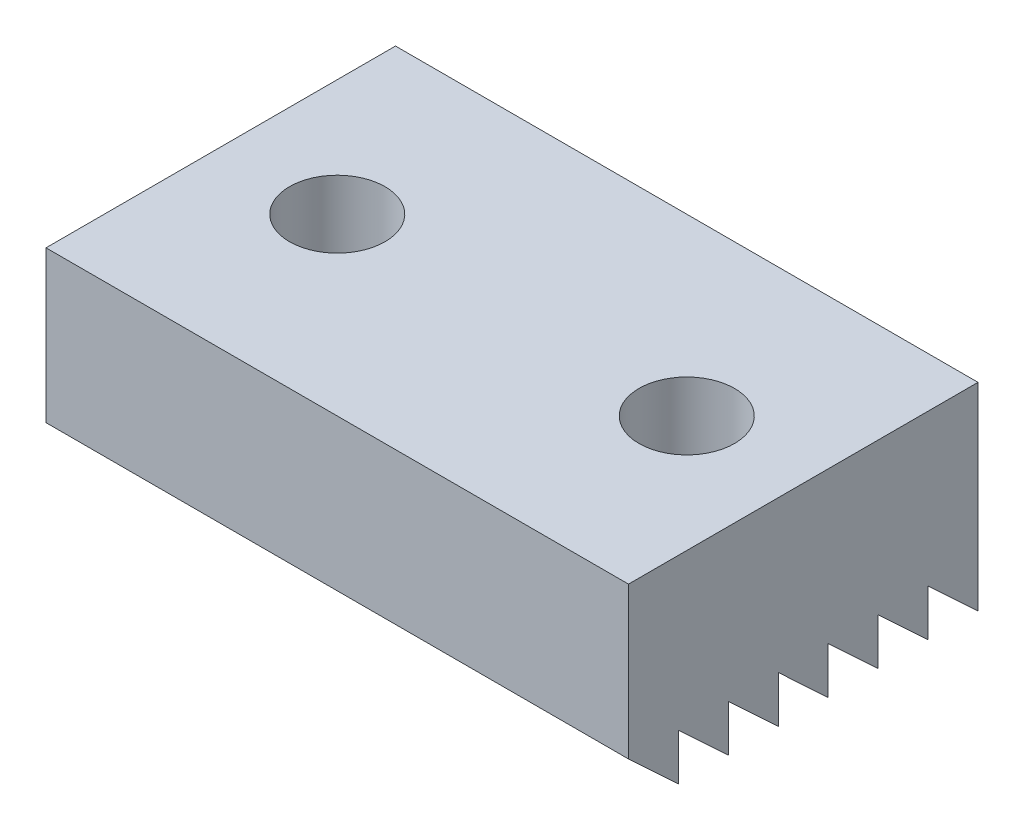
ISO-10303-21;
HEADER;
FILE_DESCRIPTION(('STEP AP214'),'2;1');
FILE_NAME('part.step','',(''),(''),'','','');
FILE_SCHEMA(('AUTOMOTIVE_DESIGN { 1 0 10303 214 1 1 1 1 }'));
ENDSEC;
DATA;
#1=APPLICATION_CONTEXT('core data for automotive mechanical design processes');
#2=APPLICATION_PROTOCOL_DEFINITION('international standard','automotive_design',2000,#1);
#3=PRODUCT_CONTEXT('',#1,'mechanical');
#4=PRODUCT('Part','Part','',(#3));
#5=PRODUCT_RELATED_PRODUCT_CATEGORY('part','',(#4));
#6=PRODUCT_DEFINITION_FORMATION('','',#4);
#7=PRODUCT_DEFINITION_CONTEXT('part definition',#1,'design');
#8=PRODUCT_DEFINITION('design','',#6,#7);
#9=PRODUCT_DEFINITION_SHAPE('','',#8);
#10=(LENGTH_UNIT() NAMED_UNIT(*) SI_UNIT(.MILLI.,.METRE.));
#11=(NAMED_UNIT(*) PLANE_ANGLE_UNIT() SI_UNIT($,.RADIAN.));
#12=(NAMED_UNIT(*) SI_UNIT($,.STERADIAN.) SOLID_ANGLE_UNIT());
#13=UNCERTAINTY_MEASURE_WITH_UNIT(LENGTH_MEASURE(1.E-05),#10,'distance_accuracy_value','');
#14=(GEOMETRIC_REPRESENTATION_CONTEXT(3) GLOBAL_UNCERTAINTY_ASSIGNED_CONTEXT((#13)) GLOBAL_UNIT_ASSIGNED_CONTEXT((#10,
#11,#12)) REPRESENTATION_CONTEXT('',''));
#15=CARTESIAN_POINT('',(0.,0.,0.));
#16=DIRECTION('',(0.,0.,1.));
#17=DIRECTION('',(1.,0.,0.));
#18=AXIS2_PLACEMENT_3D('',#15,#16,#17);
#19=CARTESIAN_POINT('',(40.4029218007494,-1.5,-6.42857142857143));
#20=DIRECTION('',(0.,0.,-1.));
#21=DIRECTION('',(-1.,0.,0.));
#22=AXIS2_PLACEMENT_3D('',#19,#20,#21);
#23=PLANE('',#22);
#24=DIRECTION('',(0.,1.,0.));
#25=VECTOR('',#24,1.);
#26=CARTESIAN_POINT('',(3.25227553191971,-24.,-6.42857142857143));
#27=LINE('',#26,#25);
#28=CARTESIAN_POINT('',(3.25227553191971,-3.5,-6.42857142857143));
#29=VERTEX_POINT('',#28);
#30=CARTESIAN_POINT('',(3.25227553191972,-1.5,-6.42857142857143));
#31=VERTEX_POINT('',#30);
#32=EDGE_CURVE('E324',#29,#31,#27,.T.);
#33=ORIENTED_EDGE('',*,*,#32,.F.);
#34=DIRECTION('',(-1.,0.,0.));
#35=VECTOR('',#34,1.);
#36=CARTESIAN_POINT('',(40.4029218007494,-3.5,-6.42857142857143));
#37=LINE('',#36,#35);
#38=CARTESIAN_POINT('',(0.,-3.5,-6.42857142857143));
#39=VERTEX_POINT('',#38);
#40=EDGE_CURVE('E297',#29,#39,#37,.T.);
#41=ORIENTED_EDGE('',*,*,#40,.T.);
#42=DIRECTION('',(0.,-1.,0.));
#43=VECTOR('',#42,1.);
#44=CARTESIAN_POINT('',(0.,-1.5,-6.42857142857143));
#45=LINE('',#44,#43);
#46=CARTESIAN_POINT('',(0.,-1.5,-6.42857142857143));
#47=VERTEX_POINT('',#46);
#48=EDGE_CURVE('E373',#47,#39,#45,.T.);
#49=ORIENTED_EDGE('',*,*,#48,.F.);
#50=DIRECTION('',(-1.,0.,0.));
#51=VECTOR('',#50,1.);
#52=CARTESIAN_POINT('',(40.4029218007494,-1.5,-6.42857142857143));
#53=LINE('',#52,#51);
#54=EDGE_CURVE('E301',#31,#47,#53,.T.);
#55=ORIENTED_EDGE('',*,*,#54,.F.);
#56=EDGE_LOOP('',(#33,#41,#49,#55));
#57=FACE_BOUND('',#56,.T.);
#58=ADVANCED_FACE('F33',(#57),#23,.T.);
#59=DIRECTION('',(0.,1.,0.));
#60=VECTOR('',#59,1.);
#61=CARTESIAN_POINT('',(6.74772446808029,-24.,-6.42857142857143));
#62=LINE('',#61,#60);
#63=CARTESIAN_POINT('',(6.74772446808029,-1.5,-6.42857142857143));
#64=VERTEX_POINT('',#63);
#65=CARTESIAN_POINT('',(6.74772446808029,-3.5,-6.42857142857143));
#66=VERTEX_POINT('',#65);
#67=EDGE_CURVE('E319',#64,#66,#62,.F.);
#68=ORIENTED_EDGE('',*,*,#67,.F.);
#69=CARTESIAN_POINT('',(18.2522755319197,-1.5,-6.42857142857143));
#70=VERTEX_POINT('',#69);
#71=EDGE_CURVE('E300',#70,#64,#53,.T.);
#72=ORIENTED_EDGE('',*,*,#71,.F.);
#73=DIRECTION('',(0.,1.,0.));
#74=VECTOR('',#73,1.);
#75=CARTESIAN_POINT('',(18.2522755319197,-24.,-6.42857142857143));
#76=LINE('',#75,#74);
#77=CARTESIAN_POINT('',(18.2522755319197,-3.5,-6.42857142857143));
#78=VERTEX_POINT('',#77);
#79=EDGE_CURVE('E460',#78,#70,#76,.T.);
#80=ORIENTED_EDGE('',*,*,#79,.F.);
#81=EDGE_CURVE('E296',#78,#66,#37,.T.);
#82=ORIENTED_EDGE('',*,*,#81,.T.);
#83=EDGE_LOOP('',(#68,#72,#80,#82));
#84=FACE_BOUND('',#83,.T.);
#85=ADVANCED_FACE('F430',(#84),#23,.T.);
#86=CARTESIAN_POINT('',(40.4029218007494,-3.5,-8.57142857142857));
#87=DIRECTION('',(0.,-0.731055268242869,0.682318250360011));
#88=DIRECTION('',(0.,-0.682318250360011,-0.731055268242869));
#89=AXIS2_PLACEMENT_3D('',#86,#87,#88);
#90=PLANE('',#89);
#91=CARTESIAN_POINT('',(5.,-2.5,-7.5));
#92=DIRECTION('',(0.,-0.731055268242869,0.682318250360011));
#93=DIRECTION('',(0.,0.682318250360011,0.731055268242869));
#94=AXIS2_PLACEMENT_3D('',#91,#92,#93);
#95=ELLIPSE('',#94,2.80416555225337,2.05);
#96=CARTESIAN_POINT('',(3.25227553191971,-3.5,-8.57142857142857));
#97=VERTEX_POINT('',#96);
#98=EDGE_CURVE('E317',#31,#97,#95,.T.);
#99=ORIENTED_EDGE('',*,*,#98,.F.);
#100=ORIENTED_EDGE('',*,*,#54,.T.);
#101=DIRECTION('',(0.,0.682318250360011,0.731055268242869));
#102=VECTOR('',#101,1.);
#103=CARTESIAN_POINT('',(0.,-3.5,-8.57142857142857));
#104=LINE('',#103,#102);
#105=CARTESIAN_POINT('',(0.,-3.5,-8.57142857142857));
#106=VERTEX_POINT('',#105);
#107=EDGE_CURVE('E370',#106,#47,#104,.T.);
#108=ORIENTED_EDGE('',*,*,#107,.F.);
#109=DIRECTION('',(-1.,0.,0.));
#110=VECTOR('',#109,1.);
#111=CARTESIAN_POINT('',(40.4029218007494,-3.5,-8.57142857142857));
#112=LINE('',#111,#110);
#113=EDGE_CURVE('E212',#97,#106,#112,.T.);
#114=ORIENTED_EDGE('',*,*,#113,.F.);
#115=EDGE_LOOP('',(#99,#100,#108,#114));
#116=FACE_BOUND('',#115,.T.);
#117=ADVANCED_FACE('F438',(#116),#90,.T.);
#118=CARTESIAN_POINT('',(6.74772446808029,-3.5,-8.57142857142857));
#119=VERTEX_POINT('',#118);
#120=EDGE_CURVE('E315',#119,#64,#95,.T.);
#121=ORIENTED_EDGE('',*,*,#120,.F.);
#122=CARTESIAN_POINT('',(18.2522755319197,-3.5,-8.57142857142857));
#123=VERTEX_POINT('',#122);
#124=EDGE_CURVE('E216',#123,#119,#112,.T.);
#125=ORIENTED_EDGE('',*,*,#124,.F.);
#126=CARTESIAN_POINT('',(20.,-2.5,-7.5));
#127=DIRECTION('',(0.,-0.731055268242869,0.682318250360011));
#128=DIRECTION('',(0.,0.682318250360011,0.731055268242869));
#129=AXIS2_PLACEMENT_3D('',#126,#127,#128);
#130=ELLIPSE('',#129,2.80416555225337,2.05);
#131=EDGE_CURVE('E313',#70,#123,#130,.T.);
#132=ORIENTED_EDGE('',*,*,#131,.F.);
#133=ORIENTED_EDGE('',*,*,#71,.T.);
#134=EDGE_LOOP('',(#121,#125,#132,#133));
#135=FACE_BOUND('',#134,.T.);
#136=ADVANCED_FACE('F311',(#135),#90,.T.);
#137=CARTESIAN_POINT('',(40.4029218007494,-1.5,-8.57142857142857));
#138=DIRECTION('',(0.,0.,-1.));
#139=DIRECTION('',(-1.,0.,0.));
#140=AXIS2_PLACEMENT_3D('',#137,#138,#139);
#141=PLANE('',#140);
#142=DIRECTION('',(0.,1.,0.));
#143=VECTOR('',#142,1.);
#144=CARTESIAN_POINT('',(3.25227553191971,-24.,-8.57142857142857));
#145=LINE('',#144,#143);
#146=CARTESIAN_POINT('',(3.25227553191972,-1.5,-8.57142857142857));
#147=VERTEX_POINT('',#146);
#148=EDGE_CURVE('E47',#97,#147,#145,.T.);
#149=ORIENTED_EDGE('',*,*,#148,.F.);
#150=ORIENTED_EDGE('',*,*,#113,.T.);
#151=DIRECTION('',(0.,-1.,0.));
#152=VECTOR('',#151,1.);
#153=CARTESIAN_POINT('',(0.,-1.5,-8.57142857142857));
#154=LINE('',#153,#152);
#155=CARTESIAN_POINT('',(0.,-1.5,-8.57142857142857));
#156=VERTEX_POINT('',#155);
#157=EDGE_CURVE('E367',#156,#106,#154,.T.);
#158=ORIENTED_EDGE('',*,*,#157,.F.);
#159=DIRECTION('',(-1.,0.,0.));
#160=VECTOR('',#159,1.);
#161=CARTESIAN_POINT('',(40.4029218007494,-1.5,-8.57142857142857));
#162=LINE('',#161,#160);
#163=EDGE_CURVE('E215',#147,#156,#162,.T.);
#164=ORIENTED_EDGE('',*,*,#163,.F.);
#165=EDGE_LOOP('',(#149,#150,#158,#164));
#166=FACE_BOUND('',#165,.T.);
#167=ADVANCED_FACE('F485',(#166),#141,.T.);
#168=DIRECTION('',(0.,1.,0.));
#169=VECTOR('',#168,1.);
#170=CARTESIAN_POINT('',(6.74772446808029,-24.,-8.57142857142857));
#171=LINE('',#170,#169);
#172=CARTESIAN_POINT('',(6.74772446808029,-1.5,-8.57142857142857));
#173=VERTEX_POINT('',#172);
#174=EDGE_CURVE('E307',#173,#119,#171,.F.);
#175=ORIENTED_EDGE('',*,*,#174,.F.);
#176=CARTESIAN_POINT('',(18.2522755319197,-1.5,-8.57142857142857));
#177=VERTEX_POINT('',#176);
#178=EDGE_CURVE('E213',#177,#173,#162,.T.);
#179=ORIENTED_EDGE('',*,*,#178,.F.);
#180=DIRECTION('',(0.,1.,0.));
#181=VECTOR('',#180,1.);
#182=CARTESIAN_POINT('',(18.2522755319197,-24.,-8.57142857142857));
#183=LINE('',#182,#181);
#184=EDGE_CURVE('E55',#123,#177,#183,.T.);
#185=ORIENTED_EDGE('',*,*,#184,.F.);
#186=ORIENTED_EDGE('',*,*,#124,.T.);
#187=EDGE_LOOP('',(#175,#179,#185,#186));
#188=FACE_BOUND('',#187,.T.);
#189=ADVANCED_FACE('F306',(#188),#141,.T.);
#190=CARTESIAN_POINT('',(0.,5.,0.));
#191=DIRECTION('',(0.,-1.,0.));
#192=DIRECTION('',(0.,0.,-1.));
#193=AXIS2_PLACEMENT_3D('',#190,#191,#192);
#194=PLANE('',#193);
#195=DIRECTION('',(0.,0.,1.));
#196=VECTOR('',#195,1.);
#197=CARTESIAN_POINT('',(0.,5.,0.));
#198=LINE('',#197,#196);
#199=CARTESIAN_POINT('',(0.,5.,-15.));
#200=VERTEX_POINT('',#199);
#201=CARTESIAN_POINT('',(0.,5.,0.));
#202=VERTEX_POINT('',#201);
#203=EDGE_CURVE('E244',#200,#202,#198,.T.);
#204=ORIENTED_EDGE('',*,*,#203,.T.);
#205=DIRECTION('',(1.,0.,0.));
#206=VECTOR('',#205,1.);
#207=CARTESIAN_POINT('',(0.,5.,0.));
#208=LINE('',#207,#206);
#209=CARTESIAN_POINT('',(25.,5.,0.));
#210=VERTEX_POINT('',#209);
#211=EDGE_CURVE('E247',#202,#210,#208,.T.);
#212=ORIENTED_EDGE('',*,*,#211,.T.);
#213=DIRECTION('',(0.,0.,-1.));
#214=VECTOR('',#213,1.);
#215=CARTESIAN_POINT('',(25.,5.,0.));
#216=LINE('',#215,#214);
#217=CARTESIAN_POINT('',(25.,5.,-15.));
#218=VERTEX_POINT('',#217);
#219=EDGE_CURVE('E249',#210,#218,#216,.T.);
#220=ORIENTED_EDGE('',*,*,#219,.T.);
#221=DIRECTION('',(-1.,0.,0.));
#222=VECTOR('',#221,1.);
#223=CARTESIAN_POINT('',(0.,5.,-15.));
#224=LINE('',#223,#222);
#225=EDGE_CURVE('E251',#218,#200,#224,.T.);
#226=ORIENTED_EDGE('',*,*,#225,.T.);
#227=EDGE_LOOP('',(#204,#212,#220,#226));
#228=FACE_BOUND('',#227,.T.);
#229=CARTESIAN_POINT('',(20.,5.,-7.5));
#230=DIRECTION('',(0.,1.,0.));
#231=DIRECTION('',(0.,0.,1.));
#232=AXIS2_PLACEMENT_3D('',#229,#230,#231);
#233=CIRCLE('',#232,2.05);
#234=CARTESIAN_POINT('',(20.,5.,-5.45));
#235=VERTEX_POINT('',#234);
#236=EDGE_CURVE('E240',#235,#235,#233,.T.);
#237=ORIENTED_EDGE('',*,*,#236,.F.);
#238=EDGE_LOOP('',(#237));
#239=FACE_BOUND('',#238,.T.);
#240=CARTESIAN_POINT('',(5.,5.,-7.5));
#241=DIRECTION('',(0.,1.,0.));
#242=DIRECTION('',(0.,0.,1.));
#243=AXIS2_PLACEMENT_3D('',#240,#241,#242);
#244=CIRCLE('',#243,2.05);
#245=CARTESIAN_POINT('',(5.,5.,-5.45));
#246=VERTEX_POINT('',#245);
#247=EDGE_CURVE('E237',#246,#246,#244,.T.);
#248=ORIENTED_EDGE('',*,*,#247,.F.);
#249=EDGE_LOOP('',(#248));
#250=FACE_BOUND('',#249,.T.);
#251=ADVANCED_FACE('F398',(#228,#239,#250),#194,.F.);
#252=CARTESIAN_POINT('',(0.,5.,0.));
#253=DIRECTION('',(1.,0.,0.));
#254=DIRECTION('',(0.,0.,-1.));
#255=AXIS2_PLACEMENT_3D('',#252,#253,#254);
#256=PLANE('',#255);
#257=DIRECTION('',(0.,-1.,0.));
#258=VECTOR('',#257,1.);
#259=CARTESIAN_POINT('',(0.,5.,-15.));
#260=LINE('',#259,#258);
#261=CARTESIAN_POINT('',(0.,-3.5,-15.));
#262=VERTEX_POINT('',#261);
#263=EDGE_CURVE('E253',#200,#262,#260,.T.);
#264=ORIENTED_EDGE('',*,*,#263,.T.);
#265=DIRECTION('',(0.,0.682318250360011,0.731055268242869));
#266=VECTOR('',#265,1.);
#267=CARTESIAN_POINT('',(0.,-3.5,-15.));
#268=LINE('',#267,#266);
#269=CARTESIAN_POINT('',(0.,-1.5,-12.8571428571429));
#270=VERTEX_POINT('',#269);
#271=EDGE_CURVE('E328',#262,#270,#268,.T.);
#272=ORIENTED_EDGE('',*,*,#271,.T.);
#273=DIRECTION('',(0.,-1.,0.));
#274=VECTOR('',#273,1.);
#275=CARTESIAN_POINT('',(0.,-1.5,-12.8571428571429));
#276=LINE('',#275,#274);
#277=CARTESIAN_POINT('',(0.,-3.5,-12.8571428571429));
#278=VERTEX_POINT('',#277);
#279=EDGE_CURVE('E355',#270,#278,#276,.T.);
#280=ORIENTED_EDGE('',*,*,#279,.T.);
#281=DIRECTION('',(0.,0.682318250360011,0.731055268242869));
#282=VECTOR('',#281,1.);
#283=CARTESIAN_POINT('',(0.,-3.5,-12.8571428571429));
#284=LINE('',#283,#282);
#285=CARTESIAN_POINT('',(0.,-1.5,-10.7142857142857));
#286=VERTEX_POINT('',#285);
#287=EDGE_CURVE('E358',#278,#286,#284,.T.);
#288=ORIENTED_EDGE('',*,*,#287,.T.);
#289=DIRECTION('',(0.,-1.,0.));
#290=VECTOR('',#289,1.);
#291=CARTESIAN_POINT('',(0.,-1.5,-10.7142857142857));
#292=LINE('',#291,#290);
#293=CARTESIAN_POINT('',(0.,-3.5,-10.7142857142857));
#294=VERTEX_POINT('',#293);
#295=EDGE_CURVE('E361',#286,#294,#292,.T.);
#296=ORIENTED_EDGE('',*,*,#295,.T.);
#297=DIRECTION('',(0.,0.682318250360011,0.731055268242869));
#298=VECTOR('',#297,1.);
#299=CARTESIAN_POINT('',(0.,-3.5,-10.7142857142857));
#300=LINE('',#299,#298);
#301=EDGE_CURVE('E364',#294,#156,#300,.T.);
#302=ORIENTED_EDGE('',*,*,#301,.T.);
#303=ORIENTED_EDGE('',*,*,#157,.T.);
#304=ORIENTED_EDGE('',*,*,#107,.T.);
#305=ORIENTED_EDGE('',*,*,#48,.T.);
#306=DIRECTION('',(0.,0.682318250360011,0.731055268242869));
#307=VECTOR('',#306,1.);
#308=CARTESIAN_POINT('',(0.,-3.5,-6.42857142857143));
#309=LINE('',#308,#307);
#310=CARTESIAN_POINT('',(0.,-1.5,-4.28571428571428));
#311=VERTEX_POINT('',#310);
#312=EDGE_CURVE('E376',#39,#311,#309,.T.);
#313=ORIENTED_EDGE('',*,*,#312,.T.);
#314=DIRECTION('',(0.,-1.,0.));
#315=VECTOR('',#314,1.);
#316=CARTESIAN_POINT('',(0.,-1.5,-4.28571428571428));
#317=LINE('',#316,#315);
#318=CARTESIAN_POINT('',(0.,-3.5,-4.28571428571428));
#319=VERTEX_POINT('',#318);
#320=EDGE_CURVE('E379',#311,#319,#317,.T.);
#321=ORIENTED_EDGE('',*,*,#320,.T.);
#322=DIRECTION('',(0.,0.682318250360011,0.731055268242869));
#323=VECTOR('',#322,1.);
#324=CARTESIAN_POINT('',(0.,-3.5,-4.28571428571428));
#325=LINE('',#324,#323);
#326=CARTESIAN_POINT('',(0.,-1.5,-2.14285714285714));
#327=VERTEX_POINT('',#326);
#328=EDGE_CURVE('E282',#319,#327,#325,.T.);
#329=ORIENTED_EDGE('',*,*,#328,.T.);
#330=DIRECTION('',(0.,-1.,0.));
#331=VECTOR('',#330,1.);
#332=CARTESIAN_POINT('',(0.,-1.5,-2.14285714285714));
#333=LINE('',#332,#331);
#334=CARTESIAN_POINT('',(0.,-3.5,-2.14285714285714));
#335=VERTEX_POINT('',#334);
#336=EDGE_CURVE('E280',#327,#335,#333,.T.);
#337=ORIENTED_EDGE('',*,*,#336,.T.);
#338=DIRECTION('',(0.,0.682318250360011,0.731055268242869));
#339=VECTOR('',#338,1.);
#340=CARTESIAN_POINT('',(0.,-3.5,-2.14285714285714));
#341=LINE('',#340,#339);
#342=CARTESIAN_POINT('',(0.,-1.5,0.));
#343=VERTEX_POINT('',#342);
#344=EDGE_CURVE('E236',#335,#343,#341,.T.);
#345=ORIENTED_EDGE('',*,*,#344,.T.);
#346=DIRECTION('',(0.,-1.,0.));
#347=VECTOR('',#346,1.);
#348=CARTESIAN_POINT('',(0.,5.,0.));
#349=LINE('',#348,#347);
#350=EDGE_CURVE('E198',#202,#343,#349,.T.);
#351=ORIENTED_EDGE('',*,*,#350,.F.);
#352=ORIENTED_EDGE('',*,*,#203,.F.);
#353=EDGE_LOOP('',(#264,#272,#280,#288,#296,#302,#303,#304,#305,#313,#321,#329,#337,#345,#351,#352));
#354=FACE_BOUND('',#353,.T.);
#355=ADVANCED_FACE('F35',(#354),#256,.F.);
#356=CARTESIAN_POINT('',(0.,5.,0.));
#357=DIRECTION('',(0.,0.,-1.));
#358=DIRECTION('',(-1.,0.,0.));
#359=AXIS2_PLACEMENT_3D('',#356,#357,#358);
#360=PLANE('',#359);
#361=ORIENTED_EDGE('',*,*,#350,.T.);
#362=DIRECTION('',(-1.,0.,0.));
#363=VECTOR('',#362,1.);
#364=CARTESIAN_POINT('',(40.4029218007494,-1.5,0.));
#365=LINE('',#364,#363);
#366=CARTESIAN_POINT('',(25.,-1.5,0.));
#367=VERTEX_POINT('',#366);
#368=EDGE_CURVE('E265',#367,#343,#365,.T.);
#369=ORIENTED_EDGE('',*,*,#368,.F.);
#370=DIRECTION('',(0.,-1.,0.));
#371=VECTOR('',#370,1.);
#372=CARTESIAN_POINT('',(25.,5.,0.));
#373=LINE('',#372,#371);
#374=EDGE_CURVE('E257',#210,#367,#373,.T.);
#375=ORIENTED_EDGE('',*,*,#374,.F.);
#376=ORIENTED_EDGE('',*,*,#211,.F.);
#377=EDGE_LOOP('',(#361,#369,#375,#376));
#378=FACE_BOUND('',#377,.T.);
#379=ADVANCED_FACE('F263',(#378),#360,.F.);
#380=CARTESIAN_POINT('',(25.,5.,0.));
#381=DIRECTION('',(-1.,0.,0.));
#382=DIRECTION('',(0.,0.,1.));
#383=AXIS2_PLACEMENT_3D('',#380,#381,#382);
#384=PLANE('',#383);
#385=ORIENTED_EDGE('',*,*,#374,.T.);
#386=DIRECTION('',(0.,-0.682318250360011,-0.731055268242869));
#387=VECTOR('',#386,1.);
#388=CARTESIAN_POINT('',(25.,-3.5,-2.14285714285714));
#389=LINE('',#388,#387);
#390=CARTESIAN_POINT('',(25.,-3.5,-2.14285714285714));
#391=VERTEX_POINT('',#390);
#392=EDGE_CURVE('E241',#367,#391,#389,.T.);
#393=ORIENTED_EDGE('',*,*,#392,.T.);
#394=DIRECTION('',(0.,1.,0.));
#395=VECTOR('',#394,1.);
#396=CARTESIAN_POINT('',(25.,-1.5,-2.14285714285714));
#397=LINE('',#396,#395);
#398=CARTESIAN_POINT('',(25.,-1.5,-2.14285714285714));
#399=VERTEX_POINT('',#398);
#400=EDGE_CURVE('E350',#391,#399,#397,.T.);
#401=ORIENTED_EDGE('',*,*,#400,.T.);
#402=DIRECTION('',(0.,-0.682318250360011,-0.731055268242869));
#403=VECTOR('',#402,1.);
#404=CARTESIAN_POINT('',(25.,-3.5,-4.28571428571428));
#405=LINE('',#404,#403);
#406=CARTESIAN_POINT('',(25.,-3.5,-4.28571428571428));
#407=VERTEX_POINT('',#406);
#408=EDGE_CURVE('E348',#399,#407,#405,.T.);
#409=ORIENTED_EDGE('',*,*,#408,.T.);
#410=DIRECTION('',(0.,1.,0.));
#411=VECTOR('',#410,1.);
#412=CARTESIAN_POINT('',(25.,-1.5,-4.28571428571428));
#413=LINE('',#412,#411);
#414=CARTESIAN_POINT('',(25.,-1.5,-4.28571428571428));
#415=VERTEX_POINT('',#414);
#416=EDGE_CURVE('E346',#407,#415,#413,.T.);
#417=ORIENTED_EDGE('',*,*,#416,.T.);
#418=DIRECTION('',(0.,-0.682318250360011,-0.731055268242869));
#419=VECTOR('',#418,1.);
#420=CARTESIAN_POINT('',(25.,-3.5,-6.42857142857143));
#421=LINE('',#420,#419);
#422=CARTESIAN_POINT('',(25.,-3.5,-6.42857142857143));
#423=VERTEX_POINT('',#422);
#424=EDGE_CURVE('E344',#415,#423,#421,.T.);
#425=ORIENTED_EDGE('',*,*,#424,.T.);
#426=DIRECTION('',(0.,1.,0.));
#427=VECTOR('',#426,1.);
#428=CARTESIAN_POINT('',(25.,-1.5,-6.42857142857143));
#429=LINE('',#428,#427);
#430=CARTESIAN_POINT('',(25.,-1.5,-6.42857142857143));
#431=VERTEX_POINT('',#430);
#432=EDGE_CURVE('E342',#423,#431,#429,.T.);
#433=ORIENTED_EDGE('',*,*,#432,.T.);
#434=DIRECTION('',(0.,-0.682318250360011,-0.731055268242869));
#435=VECTOR('',#434,1.);
#436=CARTESIAN_POINT('',(25.,-3.5,-8.57142857142857));
#437=LINE('',#436,#435);
#438=CARTESIAN_POINT('',(25.,-3.5,-8.57142857142857));
#439=VERTEX_POINT('',#438);
#440=EDGE_CURVE('E340',#431,#439,#437,.T.);
#441=ORIENTED_EDGE('',*,*,#440,.T.);
#442=DIRECTION('',(0.,1.,0.));
#443=VECTOR('',#442,1.);
#444=CARTESIAN_POINT('',(25.,-1.5,-8.57142857142857));
#445=LINE('',#444,#443);
#446=CARTESIAN_POINT('',(25.,-1.5,-8.57142857142857));
#447=VERTEX_POINT('',#446);
#448=EDGE_CURVE('E338',#439,#447,#445,.T.);
#449=ORIENTED_EDGE('',*,*,#448,.T.);
#450=DIRECTION('',(0.,-0.682318250360011,-0.731055268242869));
#451=VECTOR('',#450,1.);
#452=CARTESIAN_POINT('',(25.,-3.5,-10.7142857142857));
#453=LINE('',#452,#451);
#454=CARTESIAN_POINT('',(25.,-3.5,-10.7142857142857));
#455=VERTEX_POINT('',#454);
#456=EDGE_CURVE('E211',#447,#455,#453,.T.);
#457=ORIENTED_EDGE('',*,*,#456,.T.);
#458=DIRECTION('',(0.,1.,0.));
#459=VECTOR('',#458,1.);
#460=CARTESIAN_POINT('',(25.,-1.5,-10.7142857142857));
#461=LINE('',#460,#459);
#462=CARTESIAN_POINT('',(25.,-1.5,-10.7142857142857));
#463=VERTEX_POINT('',#462);
#464=EDGE_CURVE('E335',#455,#463,#461,.T.);
#465=ORIENTED_EDGE('',*,*,#464,.T.);
#466=DIRECTION('',(0.,-0.682318250360011,-0.731055268242869));
#467=VECTOR('',#466,1.);
#468=CARTESIAN_POINT('',(25.,-3.5,-12.8571428571429));
#469=LINE('',#468,#467);
#470=CARTESIAN_POINT('',(25.,-3.5,-12.8571428571429));
#471=VERTEX_POINT('',#470);
#472=EDGE_CURVE('E333',#463,#471,#469,.T.);
#473=ORIENTED_EDGE('',*,*,#472,.T.);
#474=DIRECTION('',(0.,1.,0.));
#475=VECTOR('',#474,1.);
#476=CARTESIAN_POINT('',(25.,-1.5,-12.8571428571429));
#477=LINE('',#476,#475);
#478=CARTESIAN_POINT('',(25.,-1.5,-12.8571428571429));
#479=VERTEX_POINT('',#478);
#480=EDGE_CURVE('E331',#471,#479,#477,.T.);
#481=ORIENTED_EDGE('',*,*,#480,.T.);
#482=DIRECTION('',(0.,-0.682318250360011,-0.731055268242869));
#483=VECTOR('',#482,1.);
#484=CARTESIAN_POINT('',(25.,-3.5,-15.));
#485=LINE('',#484,#483);
#486=CARTESIAN_POINT('',(25.,-3.5,-15.));
#487=VERTEX_POINT('',#486);
#488=EDGE_CURVE('E275',#479,#487,#485,.T.);
#489=ORIENTED_EDGE('',*,*,#488,.T.);
#490=DIRECTION('',(0.,-1.,0.));
#491=VECTOR('',#490,1.);
#492=CARTESIAN_POINT('',(25.,5.,-15.));
#493=LINE('',#492,#491);
#494=EDGE_CURVE('E255',#218,#487,#493,.T.);
#495=ORIENTED_EDGE('',*,*,#494,.F.);
#496=ORIENTED_EDGE('',*,*,#219,.F.);
#497=EDGE_LOOP('',(#385,#393,#401,#409,#417,#425,#433,#441,#449,#457,#465,#473,#481,#489,#495,#496));
#498=FACE_BOUND('',#497,.T.);
#499=ADVANCED_FACE('F392',(#498),#384,.F.);
#500=CARTESIAN_POINT('',(0.,5.,-15.));
#501=DIRECTION('',(0.,0.,1.));
#502=DIRECTION('',(1.,0.,0.));
#503=AXIS2_PLACEMENT_3D('',#500,#501,#502);
#504=PLANE('',#503);
#505=ORIENTED_EDGE('',*,*,#494,.T.);
#506=DIRECTION('',(-1.,0.,0.));
#507=VECTOR('',#506,1.);
#508=CARTESIAN_POINT('',(40.4029218007494,-3.5,-15.));
#509=LINE('',#508,#507);
#510=EDGE_CURVE('E233',#487,#262,#509,.T.);
#511=ORIENTED_EDGE('',*,*,#510,.T.);
#512=ORIENTED_EDGE('',*,*,#263,.F.);
#513=ORIENTED_EDGE('',*,*,#225,.F.);
#514=EDGE_LOOP('',(#505,#511,#512,#513));
#515=FACE_BOUND('',#514,.T.);
#516=ADVANCED_FACE('F404',(#515),#504,.F.);
#517=CARTESIAN_POINT('',(20.,5.,-7.5));
#518=DIRECTION('',(0.,-1.,0.));
#519=DIRECTION('',(0.,0.,-1.));
#520=AXIS2_PLACEMENT_3D('',#517,#518,#519);
#521=CYLINDRICAL_SURFACE('',#520,2.05);
#522=ORIENTED_EDGE('',*,*,#236,.T.);
#523=EDGE_LOOP('',(#522));
#524=FACE_BOUND('',#523,.T.);
#525=CARTESIAN_POINT('',(20.,-4.5,-7.5));
#526=DIRECTION('',(0.,-0.731055268242869,0.682318250360011));
#527=DIRECTION('',(0.,0.682318250360011,0.731055268242869));
#528=AXIS2_PLACEMENT_3D('',#525,#526,#527);
#529=ELLIPSE('',#528,2.80416555225337,2.05);
#530=CARTESIAN_POINT('',(21.7477244680803,-3.5,-6.42857142857143));
#531=VERTEX_POINT('',#530);
#532=EDGE_CURVE('E468',#531,#78,#529,.T.);
#533=ORIENTED_EDGE('',*,*,#532,.T.);
#534=ORIENTED_EDGE('',*,*,#79,.T.);
#535=ORIENTED_EDGE('',*,*,#131,.T.);
#536=ORIENTED_EDGE('',*,*,#184,.T.);
#537=CARTESIAN_POINT('',(20.,-0.499999999999994,-7.5));
#538=DIRECTION('',(0.,-0.731055268242869,0.682318250360011));
#539=DIRECTION('',(0.,0.682318250360011,0.731055268242869));
#540=AXIS2_PLACEMENT_3D('',#537,#538,#539);
#541=ELLIPSE('',#540,2.80416555225337,2.05);
#542=CARTESIAN_POINT('',(21.7477244680803,-1.5,-8.57142857142857));
#543=VERTEX_POINT('',#542);
#544=EDGE_CURVE('E41',#177,#543,#541,.T.);
#545=ORIENTED_EDGE('',*,*,#544,.T.);
#546=DIRECTION('',(0.,1.,0.));
#547=VECTOR('',#546,1.);
#548=CARTESIAN_POINT('',(21.7477244680803,-24.,-8.57142857142857));
#549=LINE('',#548,#547);
#550=CARTESIAN_POINT('',(21.7477244680803,-3.5,-8.57142857142857));
#551=VERTEX_POINT('',#550);
#552=EDGE_CURVE('E192',#543,#551,#549,.F.);
#553=ORIENTED_EDGE('',*,*,#552,.T.);
#554=CARTESIAN_POINT('',(21.7477244680803,-1.5,-6.42857142857143));
#555=VERTEX_POINT('',#554);
#556=EDGE_CURVE('E463',#551,#555,#130,.T.);
#557=ORIENTED_EDGE('',*,*,#556,.T.);
#558=DIRECTION('',(0.,1.,0.));
#559=VECTOR('',#558,1.);
#560=CARTESIAN_POINT('',(21.7477244680803,-24.,-6.42857142857143));
#561=LINE('',#560,#559);
#562=EDGE_CURVE('E456',#555,#531,#561,.F.);
#563=ORIENTED_EDGE('',*,*,#562,.T.);
#564=EDGE_LOOP('',(#533,#534,#535,#536,#545,#553,#557,#563));
#565=FACE_BOUND('',#564,.T.);
#566=ADVANCED_FACE('F191',(#524,#565),#521,.F.);
#567=CARTESIAN_POINT('',(5.,5.,-7.5));
#568=DIRECTION('',(0.,-1.,0.));
#569=DIRECTION('',(0.,0.,-1.));
#570=AXIS2_PLACEMENT_3D('',#567,#568,#569);
#571=CYLINDRICAL_SURFACE('',#570,2.05);
#572=ORIENTED_EDGE('',*,*,#247,.T.);
#573=EDGE_LOOP('',(#572));
#574=FACE_BOUND('',#573,.T.);
#575=CARTESIAN_POINT('',(5.,-4.5,-7.5));
#576=DIRECTION('',(0.,-0.731055268242869,0.682318250360011));
#577=DIRECTION('',(0.,0.682318250360011,0.731055268242869));
#578=AXIS2_PLACEMENT_3D('',#575,#576,#577);
#579=ELLIPSE('',#578,2.80416555225337,2.05);
#580=EDGE_CURVE('E326',#66,#29,#579,.T.);
#581=ORIENTED_EDGE('',*,*,#580,.T.);
#582=ORIENTED_EDGE('',*,*,#32,.T.);
#583=ORIENTED_EDGE('',*,*,#98,.T.);
#584=ORIENTED_EDGE('',*,*,#148,.T.);
#585=CARTESIAN_POINT('',(5.,-0.499999999999994,-7.5));
#586=DIRECTION('',(0.,-0.731055268242869,0.682318250360011));
#587=DIRECTION('',(0.,0.682318250360011,0.731055268242869));
#588=AXIS2_PLACEMENT_3D('',#585,#586,#587);
#589=ELLIPSE('',#588,2.80416555225337,2.05);
#590=EDGE_CURVE('E11',#147,#173,#589,.T.);
#591=ORIENTED_EDGE('',*,*,#590,.T.);
#592=ORIENTED_EDGE('',*,*,#174,.T.);
#593=ORIENTED_EDGE('',*,*,#120,.T.);
#594=ORIENTED_EDGE('',*,*,#67,.T.);
#595=EDGE_LOOP('',(#581,#582,#583,#584,#591,#592,#593,#594));
#596=FACE_BOUND('',#595,.T.);
#597=ADVANCED_FACE('F475',(#574,#596),#571,.F.);
#598=CARTESIAN_POINT('',(40.4029218007494,-3.5,-2.14285714285714));
#599=DIRECTION('',(0.,-0.731055268242869,0.682318250360011));
#600=DIRECTION('',(0.,-0.682318250360011,-0.731055268242869));
#601=AXIS2_PLACEMENT_3D('',#598,#599,#600);
#602=PLANE('',#601);
#603=ORIENTED_EDGE('',*,*,#392,.F.);
#604=ORIENTED_EDGE('',*,*,#368,.T.);
#605=ORIENTED_EDGE('',*,*,#344,.F.);
#606=DIRECTION('',(-1.,0.,0.));
#607=VECTOR('',#606,1.);
#608=CARTESIAN_POINT('',(40.4029218007494,-3.5,-2.14285714285714));
#609=LINE('',#608,#607);
#610=EDGE_CURVE('E276',#391,#335,#609,.T.);
#611=ORIENTED_EDGE('',*,*,#610,.F.);
#612=EDGE_LOOP('',(#603,#604,#605,#611));
#613=FACE_BOUND('',#612,.T.);
#614=ADVANCED_FACE('F272',(#613),#602,.T.);
#615=CARTESIAN_POINT('',(40.4029218007494,-1.5,-2.14285714285714));
#616=DIRECTION('',(0.,0.,-1.));
#617=DIRECTION('',(-1.,0.,0.));
#618=AXIS2_PLACEMENT_3D('',#615,#616,#617);
#619=PLANE('',#618);
#620=ORIENTED_EDGE('',*,*,#400,.F.);
#621=ORIENTED_EDGE('',*,*,#610,.T.);
#622=ORIENTED_EDGE('',*,*,#336,.F.);
#623=DIRECTION('',(-1.,0.,0.));
#624=VECTOR('',#623,1.);
#625=CARTESIAN_POINT('',(40.4029218007494,-1.5,-2.14285714285714));
#626=LINE('',#625,#624);
#627=EDGE_CURVE('E287',#399,#327,#626,.T.);
#628=ORIENTED_EDGE('',*,*,#627,.F.);
#629=EDGE_LOOP('',(#620,#621,#622,#628));
#630=FACE_BOUND('',#629,.T.);
#631=ADVANCED_FACE('F390',(#630),#619,.T.);
#632=CARTESIAN_POINT('',(40.4029218007494,-3.5,-4.28571428571428));
#633=DIRECTION('',(0.,-0.731055268242869,0.682318250360011));
#634=DIRECTION('',(0.,-0.682318250360011,-0.731055268242869));
#635=AXIS2_PLACEMENT_3D('',#632,#633,#634);
#636=PLANE('',#635);
#637=ORIENTED_EDGE('',*,*,#408,.F.);
#638=ORIENTED_EDGE('',*,*,#627,.T.);
#639=ORIENTED_EDGE('',*,*,#328,.F.);
#640=DIRECTION('',(-1.,0.,0.));
#641=VECTOR('',#640,1.);
#642=CARTESIAN_POINT('',(40.4029218007494,-3.5,-4.28571428571428));
#643=LINE('',#642,#641);
#644=EDGE_CURVE('E289',#407,#319,#643,.T.);
#645=ORIENTED_EDGE('',*,*,#644,.F.);
#646=EDGE_LOOP('',(#637,#638,#639,#645));
#647=FACE_BOUND('',#646,.T.);
#648=ADVANCED_FACE('F386',(#647),#636,.T.);
#649=CARTESIAN_POINT('',(40.4029218007494,-1.5,-4.28571428571428));
#650=DIRECTION('',(0.,0.,-1.));
#651=DIRECTION('',(-1.,0.,0.));
#652=AXIS2_PLACEMENT_3D('',#649,#650,#651);
#653=PLANE('',#652);
#654=ORIENTED_EDGE('',*,*,#416,.F.);
#655=ORIENTED_EDGE('',*,*,#644,.T.);
#656=ORIENTED_EDGE('',*,*,#320,.F.);
#657=DIRECTION('',(-1.,0.,0.));
#658=VECTOR('',#657,1.);
#659=CARTESIAN_POINT('',(40.4029218007494,-1.5,-4.28571428571428));
#660=LINE('',#659,#658);
#661=EDGE_CURVE('E291',#415,#311,#660,.T.);
#662=ORIENTED_EDGE('',*,*,#661,.F.);
#663=EDGE_LOOP('',(#654,#655,#656,#662));
#664=FACE_BOUND('',#663,.T.);
#665=ADVANCED_FACE('F452',(#664),#653,.T.);
#666=CARTESIAN_POINT('',(40.4029218007494,-3.5,-6.42857142857143));
#667=DIRECTION('',(0.,-0.731055268242869,0.682318250360011));
#668=DIRECTION('',(0.,-0.682318250360011,-0.731055268242869));
#669=AXIS2_PLACEMENT_3D('',#666,#667,#668);
#670=PLANE('',#669);
#671=ORIENTED_EDGE('',*,*,#580,.F.);
#672=ORIENTED_EDGE('',*,*,#81,.F.);
#673=ORIENTED_EDGE('',*,*,#532,.F.);
#674=EDGE_CURVE('E293',#423,#531,#37,.T.);
#675=ORIENTED_EDGE('',*,*,#674,.F.);
#676=ORIENTED_EDGE('',*,*,#424,.F.);
#677=ORIENTED_EDGE('',*,*,#661,.T.);
#678=ORIENTED_EDGE('',*,*,#312,.F.);
#679=ORIENTED_EDGE('',*,*,#40,.F.);
#680=EDGE_LOOP('',(#671,#672,#673,#675,#676,#677,#678,#679));
#681=FACE_BOUND('',#680,.T.);
#682=ADVANCED_FACE('F445',(#681),#670,.T.);
#683=ORIENTED_EDGE('',*,*,#562,.F.);
#684=EDGE_CURVE('E298',#431,#555,#53,.T.);
#685=ORIENTED_EDGE('',*,*,#684,.F.);
#686=ORIENTED_EDGE('',*,*,#432,.F.);
#687=ORIENTED_EDGE('',*,*,#674,.T.);
#688=EDGE_LOOP('',(#683,#685,#686,#687));
#689=FACE_BOUND('',#688,.T.);
#690=ADVANCED_FACE('F433',(#689),#23,.T.);
#691=ORIENTED_EDGE('',*,*,#556,.F.);
#692=EDGE_CURVE('E206',#439,#551,#112,.T.);
#693=ORIENTED_EDGE('',*,*,#692,.F.);
#694=ORIENTED_EDGE('',*,*,#440,.F.);
#695=ORIENTED_EDGE('',*,*,#684,.T.);
#696=EDGE_LOOP('',(#691,#693,#694,#695));
#697=FACE_BOUND('',#696,.T.);
#698=ADVANCED_FACE('F444',(#697),#90,.T.);
#699=ORIENTED_EDGE('',*,*,#552,.F.);
#700=EDGE_CURVE('E204',#447,#543,#162,.T.);
#701=ORIENTED_EDGE('',*,*,#700,.F.);
#702=ORIENTED_EDGE('',*,*,#448,.F.);
#703=ORIENTED_EDGE('',*,*,#692,.T.);
#704=EDGE_LOOP('',(#699,#701,#702,#703));
#705=FACE_BOUND('',#704,.T.);
#706=ADVANCED_FACE('F202',(#705),#141,.T.);
#707=CARTESIAN_POINT('',(40.4029218007494,-3.5,-10.7142857142857));
#708=DIRECTION('',(0.,-0.731055268242869,0.682318250360011));
#709=DIRECTION('',(0.,-0.682318250360011,-0.731055268242869));
#710=AXIS2_PLACEMENT_3D('',#707,#708,#709);
#711=PLANE('',#710);
#712=ORIENTED_EDGE('',*,*,#590,.F.);
#713=ORIENTED_EDGE('',*,*,#163,.T.);
#714=ORIENTED_EDGE('',*,*,#301,.F.);
#715=DIRECTION('',(-1.,0.,0.));
#716=VECTOR('',#715,1.);
#717=CARTESIAN_POINT('',(40.4029218007494,-3.5,-10.7142857142857));
#718=LINE('',#717,#716);
#719=EDGE_CURVE('E219',#455,#294,#718,.T.);
#720=ORIENTED_EDGE('',*,*,#719,.F.);
#721=ORIENTED_EDGE('',*,*,#456,.F.);
#722=ORIENTED_EDGE('',*,*,#700,.T.);
#723=ORIENTED_EDGE('',*,*,#544,.F.);
#724=ORIENTED_EDGE('',*,*,#178,.T.);
#725=EDGE_LOOP('',(#712,#713,#714,#720,#721,#722,#723,#724));
#726=FACE_BOUND('',#725,.T.);
#727=ADVANCED_FACE('F209',(#726),#711,.T.);
#728=CARTESIAN_POINT('',(40.4029218007494,-1.5,-10.7142857142857));
#729=DIRECTION('',(0.,0.,-1.));
#730=DIRECTION('',(-1.,0.,0.));
#731=AXIS2_PLACEMENT_3D('',#728,#729,#730);
#732=PLANE('',#731);
#733=ORIENTED_EDGE('',*,*,#464,.F.);
#734=ORIENTED_EDGE('',*,*,#719,.T.);
#735=ORIENTED_EDGE('',*,*,#295,.F.);
#736=DIRECTION('',(-1.,0.,0.));
#737=VECTOR('',#736,1.);
#738=CARTESIAN_POINT('',(40.4029218007494,-1.5,-10.7142857142857));
#739=LINE('',#738,#737);
#740=EDGE_CURVE('E223',#463,#286,#739,.T.);
#741=ORIENTED_EDGE('',*,*,#740,.F.);
#742=EDGE_LOOP('',(#733,#734,#735,#741));
#743=FACE_BOUND('',#742,.T.);
#744=ADVANCED_FACE('F419',(#743),#732,.T.);
#745=CARTESIAN_POINT('',(40.4029218007494,-3.5,-12.8571428571429));
#746=DIRECTION('',(0.,-0.731055268242869,0.682318250360011));
#747=DIRECTION('',(0.,-0.682318250360011,-0.731055268242869));
#748=AXIS2_PLACEMENT_3D('',#745,#746,#747);
#749=PLANE('',#748);
#750=ORIENTED_EDGE('',*,*,#472,.F.);
#751=ORIENTED_EDGE('',*,*,#740,.T.);
#752=ORIENTED_EDGE('',*,*,#287,.F.);
#753=DIRECTION('',(-1.,0.,0.));
#754=VECTOR('',#753,1.);
#755=CARTESIAN_POINT('',(40.4029218007494,-3.5,-12.8571428571429));
#756=LINE('',#755,#754);
#757=EDGE_CURVE('E227',#471,#278,#756,.T.);
#758=ORIENTED_EDGE('',*,*,#757,.F.);
#759=EDGE_LOOP('',(#750,#751,#752,#758));
#760=FACE_BOUND('',#759,.T.);
#761=ADVANCED_FACE('F417',(#760),#749,.T.);
#762=CARTESIAN_POINT('',(40.4029218007494,-1.5,-12.8571428571429));
#763=DIRECTION('',(0.,0.,-1.));
#764=DIRECTION('',(-1.,0.,0.));
#765=AXIS2_PLACEMENT_3D('',#762,#763,#764);
#766=PLANE('',#765);
#767=ORIENTED_EDGE('',*,*,#480,.F.);
#768=ORIENTED_EDGE('',*,*,#757,.T.);
#769=ORIENTED_EDGE('',*,*,#279,.F.);
#770=DIRECTION('',(-1.,0.,0.));
#771=VECTOR('',#770,1.);
#772=CARTESIAN_POINT('',(40.4029218007494,-1.5,-12.8571428571429));
#773=LINE('',#772,#771);
#774=EDGE_CURVE('E231',#479,#270,#773,.T.);
#775=ORIENTED_EDGE('',*,*,#774,.F.);
#776=EDGE_LOOP('',(#767,#768,#769,#775));
#777=FACE_BOUND('',#776,.T.);
#778=ADVANCED_FACE('F412',(#777),#766,.T.);
#779=CARTESIAN_POINT('',(40.4029218007494,-3.5,-15.));
#780=DIRECTION('',(0.,-0.731055268242869,0.682318250360011));
#781=DIRECTION('',(0.,-0.682318250360011,-0.731055268242869));
#782=AXIS2_PLACEMENT_3D('',#779,#780,#781);
#783=PLANE('',#782);
#784=ORIENTED_EDGE('',*,*,#488,.F.);
#785=ORIENTED_EDGE('',*,*,#774,.T.);
#786=ORIENTED_EDGE('',*,*,#271,.F.);
#787=ORIENTED_EDGE('',*,*,#510,.F.);
#788=EDGE_LOOP('',(#784,#785,#786,#787));
#789=FACE_BOUND('',#788,.T.);
#790=ADVANCED_FACE('F407',(#789),#783,.T.);
#791=CLOSED_SHELL('',(#58,#85,#117,#136,#167,#189,#251,#355,#379,#499,#516,#566,#597,#614,#631,
#648,#665,#682,#690,#698,#706,#727,#744,#761,#778,#790));
#792=MANIFOLD_SOLID_BREP('B2',#791);
#793=ADVANCED_BREP_SHAPE_REPRESENTATION('',(#18,#792),#14);
#794=SHAPE_DEFINITION_REPRESENTATION(#9,#793);
ENDSEC;
END-ISO-10303-21;
